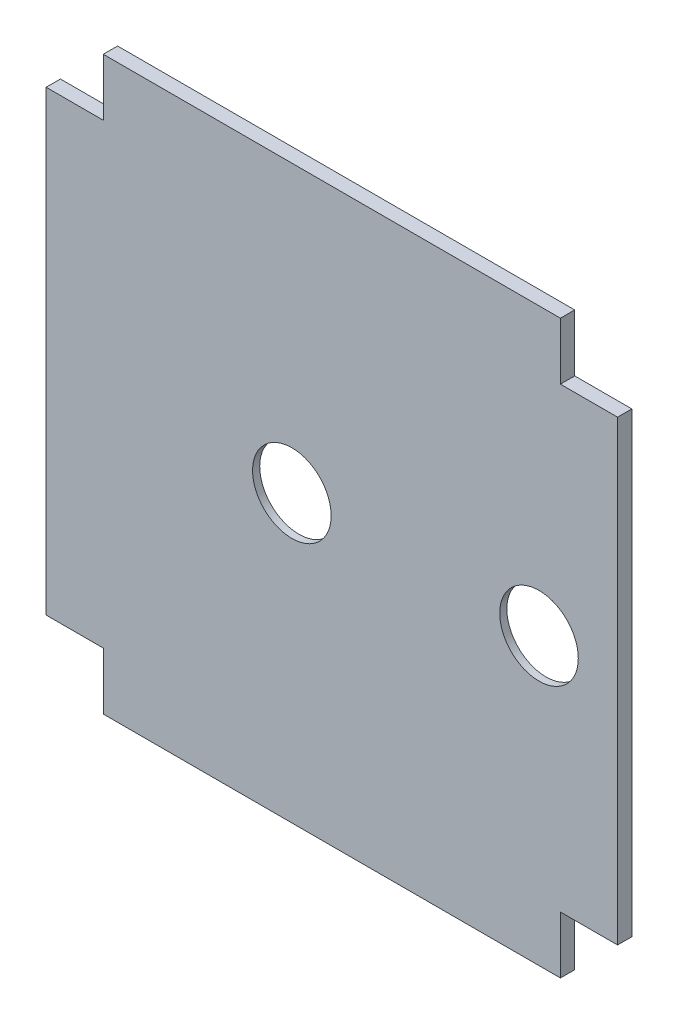
ISO-10303-21;
HEADER;
FILE_DESCRIPTION(('STEP AP214'),'2;1');
FILE_NAME('part.step','',(''),(''),'','','');
FILE_SCHEMA(('AUTOMOTIVE_DESIGN { 1 0 10303 214 1 1 1 1 }'));
ENDSEC;
DATA;
#1=APPLICATION_CONTEXT('core data for automotive mechanical design processes');
#2=APPLICATION_PROTOCOL_DEFINITION('international standard','automotive_design',2000,#1);
#3=PRODUCT_CONTEXT('',#1,'mechanical');
#4=PRODUCT('Part','Part','',(#3));
#5=PRODUCT_RELATED_PRODUCT_CATEGORY('part','',(#4));
#6=PRODUCT_DEFINITION_FORMATION('','',#4);
#7=PRODUCT_DEFINITION_CONTEXT('part definition',#1,'design');
#8=PRODUCT_DEFINITION('design','',#6,#7);
#9=PRODUCT_DEFINITION_SHAPE('','',#8);
#10=(LENGTH_UNIT() NAMED_UNIT(*) SI_UNIT(.MILLI.,.METRE.));
#11=(NAMED_UNIT(*) PLANE_ANGLE_UNIT() SI_UNIT($,.RADIAN.));
#12=(NAMED_UNIT(*) SI_UNIT($,.STERADIAN.) SOLID_ANGLE_UNIT());
#13=UNCERTAINTY_MEASURE_WITH_UNIT(LENGTH_MEASURE(1.E-05),#10,'distance_accuracy_value','');
#14=(GEOMETRIC_REPRESENTATION_CONTEXT(3) GLOBAL_UNCERTAINTY_ASSIGNED_CONTEXT((#13)) GLOBAL_UNIT_ASSIGNED_CONTEXT((#10,
#11,#12)) REPRESENTATION_CONTEXT('',''));
#15=CARTESIAN_POINT('',(0.,0.,0.));
#16=DIRECTION('',(0.,0.,1.));
#17=DIRECTION('',(1.,0.,0.));
#18=AXIS2_PLACEMENT_3D('',#15,#16,#17);
#19=CARTESIAN_POINT('',(172.000168937868,199.966321146699,0.));
#20=DIRECTION('',(0.,0.,1.));
#21=DIRECTION('',(1.,0.,0.));
#22=AXIS2_PLACEMENT_3D('',#19,#20,#21);
#23=CYLINDRICAL_SURFACE('',#22,27.5);
#24=CARTESIAN_POINT('',(172.000168937868,199.966321146699,10.));
#25=DIRECTION('',(0.,0.,1.));
#26=DIRECTION('',(1.,0.,0.));
#27=AXIS2_PLACEMENT_3D('',#24,#25,#26);
#28=CIRCLE('',#27,27.5);
#29=CARTESIAN_POINT('',(199.500168937868,199.966321146699,10.));
#30=VERTEX_POINT('',#29);
#31=EDGE_CURVE('E161',#30,#30,#28,.T.);
#32=ORIENTED_EDGE('',*,*,#31,.T.);
#33=EDGE_LOOP('',(#32));
#34=FACE_BOUND('',#33,.T.);
#35=CARTESIAN_POINT('',(172.000168937868,199.966321146699,5.));
#36=DIRECTION('',(0.,0.,-1.));
#37=DIRECTION('',(-1.,0.,0.));
#38=AXIS2_PLACEMENT_3D('',#35,#36,#37);
#39=CIRCLE('',#38,27.5);
#40=CARTESIAN_POINT('',(144.500168937868,199.966321146699,5.));
#41=VERTEX_POINT('',#40);
#42=EDGE_CURVE('E36',#41,#41,#39,.F.);
#43=ORIENTED_EDGE('',*,*,#42,.F.);
#44=EDGE_LOOP('',(#43));
#45=FACE_BOUND('',#44,.T.);
#46=ADVANCED_FACE('F32',(#34,#45),#23,.F.);
#47=CARTESIAN_POINT('',(345.000168937868,199.966321146699,0.));
#48=DIRECTION('',(0.,0.,1.));
#49=DIRECTION('',(1.,0.,0.));
#50=AXIS2_PLACEMENT_3D('',#47,#48,#49);
#51=CYLINDRICAL_SURFACE('',#50,27.5);
#52=CARTESIAN_POINT('',(345.000168937868,199.966321146699,10.));
#53=DIRECTION('',(0.,0.,1.));
#54=DIRECTION('',(1.,0.,0.));
#55=AXIS2_PLACEMENT_3D('',#52,#53,#54);
#56=CIRCLE('',#55,27.5);
#57=CARTESIAN_POINT('',(372.500168937868,199.966321146699,10.));
#58=VERTEX_POINT('',#57);
#59=EDGE_CURVE('E168',#58,#58,#56,.T.);
#60=ORIENTED_EDGE('',*,*,#59,.T.);
#61=EDGE_LOOP('',(#60));
#62=FACE_BOUND('',#61,.T.);
#63=CARTESIAN_POINT('',(345.000168937868,199.966321146699,5.));
#64=DIRECTION('',(0.,0.,-1.));
#65=DIRECTION('',(-1.,0.,0.));
#66=AXIS2_PLACEMENT_3D('',#63,#64,#65);
#67=CIRCLE('',#66,27.5);
#68=CARTESIAN_POINT('',(317.500168937868,199.966321146699,5.));
#69=VERTEX_POINT('',#68);
#70=EDGE_CURVE('E172',#69,#69,#67,.F.);
#71=ORIENTED_EDGE('',*,*,#70,.F.);
#72=EDGE_LOOP('',(#71));
#73=FACE_BOUND('',#72,.T.);
#74=ADVANCED_FACE('F218',(#62,#73),#51,.F.);
#75=CARTESIAN_POINT('',(0.,0.,10.));
#76=DIRECTION('',(-1.,0.,0.));
#77=DIRECTION('',(0.,0.,1.));
#78=AXIS2_PLACEMENT_3D('',#75,#76,#77);
#79=PLANE('',#78);
#80=DIRECTION('',(0.,0.,-1.));
#81=VECTOR('',#80,1.);
#82=CARTESIAN_POINT('',(0.,360.,10.));
#83=LINE('',#82,#81);
#84=CARTESIAN_POINT('',(0.,360.,10.));
#85=VERTEX_POINT('',#84);
#86=CARTESIAN_POINT('',(0.,360.,0.));
#87=VERTEX_POINT('',#86);
#88=EDGE_CURVE('E283',#85,#87,#83,.T.);
#89=ORIENTED_EDGE('',*,*,#88,.T.);
#90=DIRECTION('',(0.,1.,0.));
#91=VECTOR('',#90,1.);
#92=CARTESIAN_POINT('',(0.,0.,0.));
#93=LINE('',#92,#91);
#94=CARTESIAN_POINT('',(0.,40.,0.));
#95=VERTEX_POINT('',#94);
#96=EDGE_CURVE('E144',#95,#87,#93,.T.);
#97=ORIENTED_EDGE('',*,*,#96,.F.);
#98=DIRECTION('',(0.,0.,-1.));
#99=VECTOR('',#98,1.);
#100=CARTESIAN_POINT('',(0.,40.,10.));
#101=LINE('',#100,#99);
#102=CARTESIAN_POINT('',(0.,40.,10.));
#103=VERTEX_POINT('',#102);
#104=EDGE_CURVE('E128',#103,#95,#101,.T.);
#105=ORIENTED_EDGE('',*,*,#104,.F.);
#106=DIRECTION('',(0.,1.,0.));
#107=VECTOR('',#106,1.);
#108=CARTESIAN_POINT('',(0.,0.,10.));
#109=LINE('',#108,#107);
#110=EDGE_CURVE('E142',#103,#85,#109,.T.);
#111=ORIENTED_EDGE('',*,*,#110,.T.);
#112=EDGE_LOOP('',(#89,#97,#105,#111));
#113=FACE_BOUND('',#112,.T.);
#114=ADVANCED_FACE('F34',(#113),#79,.T.);
#115=CARTESIAN_POINT('',(0.,0.,10.));
#116=DIRECTION('',(0.,1.,0.));
#117=DIRECTION('',(0.,0.,1.));
#118=AXIS2_PLACEMENT_3D('',#115,#116,#117);
#119=PLANE('',#118);
#120=DIRECTION('',(1.,0.,0.));
#121=VECTOR('',#120,1.);
#122=CARTESIAN_POINT('',(0.,0.,0.));
#123=LINE('',#122,#121);
#124=CARTESIAN_POINT('',(40.,0.,0.));
#125=VERTEX_POINT('',#124);
#126=CARTESIAN_POINT('',(360.,0.,0.));
#127=VERTEX_POINT('',#126);
#128=EDGE_CURVE('E153',#125,#127,#123,.T.);
#129=ORIENTED_EDGE('',*,*,#128,.T.);
#130=DIRECTION('',(0.,0.,-1.));
#131=VECTOR('',#130,1.);
#132=CARTESIAN_POINT('',(360.,0.,10.));
#133=LINE('',#132,#131);
#134=CARTESIAN_POINT('',(360.,0.,10.));
#135=VERTEX_POINT('',#134);
#136=EDGE_CURVE('E49',#135,#127,#133,.T.);
#137=ORIENTED_EDGE('',*,*,#136,.F.);
#138=DIRECTION('',(1.,0.,0.));
#139=VECTOR('',#138,1.);
#140=CARTESIAN_POINT('',(0.,0.,10.));
#141=LINE('',#140,#139);
#142=CARTESIAN_POINT('',(40.,0.,10.));
#143=VERTEX_POINT('',#142);
#144=EDGE_CURVE('E11',#143,#135,#141,.T.);
#145=ORIENTED_EDGE('',*,*,#144,.F.);
#146=DIRECTION('',(0.,0.,-1.));
#147=VECTOR('',#146,1.);
#148=CARTESIAN_POINT('',(40.,0.,10.));
#149=LINE('',#148,#147);
#150=EDGE_CURVE('E269',#143,#125,#149,.T.);
#151=ORIENTED_EDGE('',*,*,#150,.T.);
#152=EDGE_LOOP('',(#129,#137,#145,#151));
#153=FACE_BOUND('',#152,.T.);
#154=ADVANCED_FACE('F275',(#153),#119,.F.);
#155=CARTESIAN_POINT('',(400.,0.,10.));
#156=DIRECTION('',(-1.,0.,0.));
#157=DIRECTION('',(0.,0.,1.));
#158=AXIS2_PLACEMENT_3D('',#155,#156,#157);
#159=PLANE('',#158);
#160=DIRECTION('',(0.,1.,0.));
#161=VECTOR('',#160,1.);
#162=CARTESIAN_POINT('',(400.,0.,10.));
#163=LINE('',#162,#161);
#164=CARTESIAN_POINT('',(400.,40.,10.));
#165=VERTEX_POINT('',#164);
#166=CARTESIAN_POINT('',(400.,360.,10.));
#167=VERTEX_POINT('',#166);
#168=EDGE_CURVE('E41',#165,#167,#163,.T.);
#169=ORIENTED_EDGE('',*,*,#168,.F.);
#170=DIRECTION('',(0.,0.,-1.));
#171=VECTOR('',#170,1.);
#172=CARTESIAN_POINT('',(400.,40.,10.));
#173=LINE('',#172,#171);
#174=CARTESIAN_POINT('',(400.,40.,0.));
#175=VERTEX_POINT('',#174);
#176=EDGE_CURVE('E293',#165,#175,#173,.T.);
#177=ORIENTED_EDGE('',*,*,#176,.T.);
#178=DIRECTION('',(0.,1.,0.));
#179=VECTOR('',#178,1.);
#180=CARTESIAN_POINT('',(400.,0.,0.));
#181=LINE('',#180,#179);
#182=CARTESIAN_POINT('',(400.,360.,0.));
#183=VERTEX_POINT('',#182);
#184=EDGE_CURVE('E158',#175,#183,#181,.T.);
#185=ORIENTED_EDGE('',*,*,#184,.T.);
#186=DIRECTION('',(0.,0.,-1.));
#187=VECTOR('',#186,1.);
#188=CARTESIAN_POINT('',(400.,360.,10.));
#189=LINE('',#188,#187);
#190=EDGE_CURVE('E57',#167,#183,#189,.T.);
#191=ORIENTED_EDGE('',*,*,#190,.F.);
#192=EDGE_LOOP('',(#169,#177,#185,#191));
#193=FACE_BOUND('',#192,.T.);
#194=ADVANCED_FACE('F214',(#193),#159,.F.);
#195=CARTESIAN_POINT('',(0.,400.,10.));
#196=DIRECTION('',(0.,1.,0.));
#197=DIRECTION('',(0.,0.,1.));
#198=AXIS2_PLACEMENT_3D('',#195,#196,#197);
#199=PLANE('',#198);
#200=DIRECTION('',(0.,0.,-1.));
#201=VECTOR('',#200,1.);
#202=CARTESIAN_POINT('',(40.,400.,10.));
#203=LINE('',#202,#201);
#204=CARTESIAN_POINT('',(40.,400.,10.));
#205=VERTEX_POINT('',#204);
#206=CARTESIAN_POINT('',(40.,400.,0.));
#207=VERTEX_POINT('',#206);
#208=EDGE_CURVE('E304',#205,#207,#203,.T.);
#209=ORIENTED_EDGE('',*,*,#208,.F.);
#210=DIRECTION('',(1.,0.,0.));
#211=VECTOR('',#210,1.);
#212=CARTESIAN_POINT('',(0.,400.,10.));
#213=LINE('',#212,#211);
#214=CARTESIAN_POINT('',(360.,400.,10.));
#215=VERTEX_POINT('',#214);
#216=EDGE_CURVE('E152',#205,#215,#213,.T.);
#217=ORIENTED_EDGE('',*,*,#216,.T.);
#218=DIRECTION('',(0.,0.,-1.));
#219=VECTOR('',#218,1.);
#220=CARTESIAN_POINT('',(360.,400.,10.));
#221=LINE('',#220,#219);
#222=CARTESIAN_POINT('',(360.,400.,0.));
#223=VERTEX_POINT('',#222);
#224=EDGE_CURVE('E193',#215,#223,#221,.T.);
#225=ORIENTED_EDGE('',*,*,#224,.T.);
#226=DIRECTION('',(1.,0.,0.));
#227=VECTOR('',#226,1.);
#228=CARTESIAN_POINT('',(0.,400.,0.));
#229=LINE('',#228,#227);
#230=EDGE_CURVE('E167',#207,#223,#229,.T.);
#231=ORIENTED_EDGE('',*,*,#230,.F.);
#232=EDGE_LOOP('',(#209,#217,#225,#231));
#233=FACE_BOUND('',#232,.T.);
#234=ADVANCED_FACE('F204',(#233),#199,.T.);
#235=CARTESIAN_POINT('',(0.,0.,10.));
#236=DIRECTION('',(0.,0.,-1.));
#237=DIRECTION('',(-1.,0.,0.));
#238=AXIS2_PLACEMENT_3D('',#235,#236,#237);
#239=PLANE('',#238);
#240=ORIENTED_EDGE('',*,*,#59,.F.);
#241=EDGE_LOOP('',(#240));
#242=FACE_BOUND('',#241,.T.);
#243=ORIENTED_EDGE('',*,*,#31,.F.);
#244=EDGE_LOOP('',(#243));
#245=FACE_BOUND('',#244,.T.);
#246=DIRECTION('',(0.,1.,0.));
#247=VECTOR('',#246,1.);
#248=CARTESIAN_POINT('',(360.,0.,10.));
#249=LINE('',#248,#247);
#250=CARTESIAN_POINT('',(360.,40.,10.));
#251=VERTEX_POINT('',#250);
#252=EDGE_CURVE('E285',#135,#251,#249,.T.);
#253=ORIENTED_EDGE('',*,*,#252,.T.);
#254=DIRECTION('',(1.,0.,0.));
#255=VECTOR('',#254,1.);
#256=CARTESIAN_POINT('',(400.,40.,10.));
#257=LINE('',#256,#255);
#258=EDGE_CURVE('E290',#251,#165,#257,.T.);
#259=ORIENTED_EDGE('',*,*,#258,.T.);
#260=ORIENTED_EDGE('',*,*,#168,.T.);
#261=DIRECTION('',(-1.,0.,0.));
#262=VECTOR('',#261,1.);
#263=CARTESIAN_POINT('',(400.,360.,10.));
#264=LINE('',#263,#262);
#265=CARTESIAN_POINT('',(360.,360.,10.));
#266=VERTEX_POINT('',#265);
#267=EDGE_CURVE('E310',#167,#266,#264,.T.);
#268=ORIENTED_EDGE('',*,*,#267,.T.);
#269=DIRECTION('',(0.,1.,0.));
#270=VECTOR('',#269,1.);
#271=CARTESIAN_POINT('',(360.,400.,10.));
#272=LINE('',#271,#270);
#273=EDGE_CURVE('E313',#266,#215,#272,.T.);
#274=ORIENTED_EDGE('',*,*,#273,.T.);
#275=ORIENTED_EDGE('',*,*,#216,.F.);
#276=DIRECTION('',(0.,-1.,0.));
#277=VECTOR('',#276,1.);
#278=CARTESIAN_POINT('',(40.,400.,10.));
#279=LINE('',#278,#277);
#280=CARTESIAN_POINT('',(40.,360.,10.));
#281=VERTEX_POINT('',#280);
#282=EDGE_CURVE('E300',#205,#281,#279,.T.);
#283=ORIENTED_EDGE('',*,*,#282,.T.);
#284=DIRECTION('',(-1.,0.,0.));
#285=VECTOR('',#284,1.);
#286=CARTESIAN_POINT('',(0.,360.,10.));
#287=LINE('',#286,#285);
#288=EDGE_CURVE('E151',#281,#85,#287,.T.);
#289=ORIENTED_EDGE('',*,*,#288,.T.);
#290=ORIENTED_EDGE('',*,*,#110,.F.);
#291=DIRECTION('',(1.,0.,0.));
#292=VECTOR('',#291,1.);
#293=CARTESIAN_POINT('',(0.,40.,10.));
#294=LINE('',#293,#292);
#295=CARTESIAN_POINT('',(40.,40.,10.));
#296=VERTEX_POINT('',#295);
#297=EDGE_CURVE('E124',#103,#296,#294,.T.);
#298=ORIENTED_EDGE('',*,*,#297,.T.);
#299=DIRECTION('',(0.,-1.,0.));
#300=VECTOR('',#299,1.);
#301=CARTESIAN_POINT('',(40.,0.,10.));
#302=LINE('',#301,#300);
#303=EDGE_CURVE('E135',#296,#143,#302,.T.);
#304=ORIENTED_EDGE('',*,*,#303,.T.);
#305=ORIENTED_EDGE('',*,*,#144,.T.);
#306=EDGE_LOOP('',(#253,#259,#260,#268,#274,#275,#283,#289,#290,#298,#304,#305));
#307=FACE_BOUND('',#306,.T.);
#308=ADVANCED_FACE('F148',(#242,#245,#307),#239,.F.);
#309=CARTESIAN_POINT('',(0.,0.,0.));
#310=DIRECTION('',(0.,0.,-1.));
#311=DIRECTION('',(-1.,0.,0.));
#312=AXIS2_PLACEMENT_3D('',#309,#310,#311);
#313=PLANE('',#312);
#314=DIRECTION('',(1.,0.,0.));
#315=VECTOR('',#314,1.);
#316=CARTESIAN_POINT('',(400.,40.,0.));
#317=LINE('',#316,#315);
#318=CARTESIAN_POINT('',(360.,40.,0.));
#319=VERTEX_POINT('',#318);
#320=EDGE_CURVE('E282',#319,#175,#317,.T.);
#321=ORIENTED_EDGE('',*,*,#320,.F.);
#322=DIRECTION('',(0.,1.,0.));
#323=VECTOR('',#322,1.);
#324=CARTESIAN_POINT('',(360.,0.,0.));
#325=LINE('',#324,#323);
#326=EDGE_CURVE('E280',#127,#319,#325,.T.);
#327=ORIENTED_EDGE('',*,*,#326,.F.);
#328=ORIENTED_EDGE('',*,*,#128,.F.);
#329=DIRECTION('',(0.,-1.,0.));
#330=VECTOR('',#329,1.);
#331=CARTESIAN_POINT('',(40.,0.,0.));
#332=LINE('',#331,#330);
#333=CARTESIAN_POINT('',(40.,40.,0.));
#334=VERTEX_POINT('',#333);
#335=EDGE_CURVE('E136',#334,#125,#332,.T.);
#336=ORIENTED_EDGE('',*,*,#335,.F.);
#337=DIRECTION('',(1.,0.,0.));
#338=VECTOR('',#337,1.);
#339=CARTESIAN_POINT('',(0.,40.,0.));
#340=LINE('',#339,#338);
#341=EDGE_CURVE('E271',#95,#334,#340,.T.);
#342=ORIENTED_EDGE('',*,*,#341,.F.);
#343=ORIENTED_EDGE('',*,*,#96,.T.);
#344=DIRECTION('',(-1.,0.,0.));
#345=VECTOR('',#344,1.);
#346=CARTESIAN_POINT('',(0.,360.,0.));
#347=LINE('',#346,#345);
#348=CARTESIAN_POINT('',(40.,360.,0.));
#349=VERTEX_POINT('',#348);
#350=EDGE_CURVE('E302',#349,#87,#347,.T.);
#351=ORIENTED_EDGE('',*,*,#350,.F.);
#352=DIRECTION('',(0.,-1.,0.));
#353=VECTOR('',#352,1.);
#354=CARTESIAN_POINT('',(40.,400.,0.));
#355=LINE('',#354,#353);
#356=EDGE_CURVE('E276',#207,#349,#355,.T.);
#357=ORIENTED_EDGE('',*,*,#356,.F.);
#358=ORIENTED_EDGE('',*,*,#230,.T.);
#359=DIRECTION('',(0.,1.,0.));
#360=VECTOR('',#359,1.);
#361=CARTESIAN_POINT('',(360.,400.,0.));
#362=LINE('',#361,#360);
#363=CARTESIAN_POINT('',(360.,360.,0.));
#364=VERTEX_POINT('',#363);
#365=EDGE_CURVE('E314',#364,#223,#362,.T.);
#366=ORIENTED_EDGE('',*,*,#365,.F.);
#367=DIRECTION('',(-1.,0.,0.));
#368=VECTOR('',#367,1.);
#369=CARTESIAN_POINT('',(400.,360.,0.));
#370=LINE('',#369,#368);
#371=EDGE_CURVE('E296',#183,#364,#370,.T.);
#372=ORIENTED_EDGE('',*,*,#371,.F.);
#373=ORIENTED_EDGE('',*,*,#184,.F.);
#374=EDGE_LOOP('',(#321,#327,#328,#336,#342,#343,#351,#357,#358,#366,#372,#373));
#375=FACE_BOUND('',#374,.T.);
#376=CARTESIAN_POINT('',(345.000168937868,199.966321146699,0.));
#377=DIRECTION('',(0.,0.,-1.));
#378=DIRECTION('',(-1.,0.,0.));
#379=AXIS2_PLACEMENT_3D('',#376,#377,#378);
#380=CIRCLE('',#379,35.);
#381=CARTESIAN_POINT('',(310.000168937868,199.966321146699,0.));
#382=VERTEX_POINT('',#381);
#383=EDGE_CURVE('E179',#382,#382,#380,.T.);
#384=ORIENTED_EDGE('',*,*,#383,.F.);
#385=EDGE_LOOP('',(#384));
#386=FACE_BOUND('',#385,.T.);
#387=CARTESIAN_POINT('',(172.000168937868,199.966321146699,0.));
#388=DIRECTION('',(0.,0.,-1.));
#389=DIRECTION('',(-1.,0.,0.));
#390=AXIS2_PLACEMENT_3D('',#387,#388,#389);
#391=CIRCLE('',#390,35.);
#392=CARTESIAN_POINT('',(137.000168937868,199.966321146699,0.));
#393=VERTEX_POINT('',#392);
#394=EDGE_CURVE('E191',#393,#393,#391,.T.);
#395=ORIENTED_EDGE('',*,*,#394,.F.);
#396=EDGE_LOOP('',(#395));
#397=FACE_BOUND('',#396,.T.);
#398=ADVANCED_FACE('F203',(#375,#386,#397),#313,.T.);
#399=CARTESIAN_POINT('',(345.000168937868,199.966321146699,5.));
#400=DIRECTION('',(0.,0.,-1.));
#401=DIRECTION('',(-1.,0.,0.));
#402=AXIS2_PLACEMENT_3D('',#399,#400,#401);
#403=PLANE('',#402);
#404=CARTESIAN_POINT('',(345.000168937868,199.966321146699,5.));
#405=DIRECTION('',(0.,0.,-1.));
#406=DIRECTION('',(-1.,0.,0.));
#407=AXIS2_PLACEMENT_3D('',#404,#405,#406);
#408=CIRCLE('',#407,35.);
#409=CARTESIAN_POINT('',(310.000168937868,199.966321146699,5.));
#410=VERTEX_POINT('',#409);
#411=EDGE_CURVE('E174',#410,#410,#408,.T.);
#412=ORIENTED_EDGE('',*,*,#411,.T.);
#413=EDGE_LOOP('',(#412));
#414=FACE_BOUND('',#413,.T.);
#415=ORIENTED_EDGE('',*,*,#70,.T.);
#416=EDGE_LOOP('',(#415));
#417=FACE_BOUND('',#416,.T.);
#418=ADVANCED_FACE('F211',(#414,#417),#403,.T.);
#419=CARTESIAN_POINT('',(345.000168937868,199.966321146699,5.));
#420=DIRECTION('',(0.,0.,-1.));
#421=DIRECTION('',(-1.,0.,0.));
#422=AXIS2_PLACEMENT_3D('',#419,#420,#421);
#423=CYLINDRICAL_SURFACE('',#422,35.);
#424=ORIENTED_EDGE('',*,*,#411,.F.);
#425=EDGE_LOOP('',(#424));
#426=FACE_BOUND('',#425,.T.);
#427=ORIENTED_EDGE('',*,*,#383,.T.);
#428=EDGE_LOOP('',(#427));
#429=FACE_BOUND('',#428,.T.);
#430=ADVANCED_FACE('F232',(#426,#429),#423,.F.);
#431=CARTESIAN_POINT('',(172.000168937868,199.966321146699,5.));
#432=DIRECTION('',(0.,0.,-1.));
#433=DIRECTION('',(-1.,0.,0.));
#434=AXIS2_PLACEMENT_3D('',#431,#432,#433);
#435=PLANE('',#434);
#436=CARTESIAN_POINT('',(172.000168937868,199.966321146699,5.));
#437=DIRECTION('',(0.,0.,-1.));
#438=DIRECTION('',(-1.,0.,0.));
#439=AXIS2_PLACEMENT_3D('',#436,#437,#438);
#440=CIRCLE('',#439,35.);
#441=CARTESIAN_POINT('',(137.000168937868,199.966321146699,5.));
#442=VERTEX_POINT('',#441);
#443=EDGE_CURVE('E184',#442,#442,#440,.T.);
#444=ORIENTED_EDGE('',*,*,#443,.T.);
#445=EDGE_LOOP('',(#444));
#446=FACE_BOUND('',#445,.T.);
#447=ORIENTED_EDGE('',*,*,#42,.T.);
#448=EDGE_LOOP('',(#447));
#449=FACE_BOUND('',#448,.T.);
#450=ADVANCED_FACE('F228',(#446,#449),#435,.T.);
#451=CARTESIAN_POINT('',(172.000168937868,199.966321146699,5.));
#452=DIRECTION('',(0.,0.,-1.));
#453=DIRECTION('',(-1.,0.,0.));
#454=AXIS2_PLACEMENT_3D('',#451,#452,#453);
#455=CYLINDRICAL_SURFACE('',#454,35.);
#456=ORIENTED_EDGE('',*,*,#443,.F.);
#457=EDGE_LOOP('',(#456));
#458=FACE_BOUND('',#457,.T.);
#459=ORIENTED_EDGE('',*,*,#394,.T.);
#460=EDGE_LOOP('',(#459));
#461=FACE_BOUND('',#460,.T.);
#462=ADVANCED_FACE('F224',(#458,#461),#455,.F.);
#463=CARTESIAN_POINT('',(360.,400.,10.));
#464=DIRECTION('',(-1.,0.,0.));
#465=DIRECTION('',(0.,0.,1.));
#466=AXIS2_PLACEMENT_3D('',#463,#464,#465);
#467=PLANE('',#466);
#468=ORIENTED_EDGE('',*,*,#365,.T.);
#469=ORIENTED_EDGE('',*,*,#224,.F.);
#470=ORIENTED_EDGE('',*,*,#273,.F.);
#471=DIRECTION('',(0.,0.,-1.));
#472=VECTOR('',#471,1.);
#473=CARTESIAN_POINT('',(360.,360.,10.));
#474=LINE('',#473,#472);
#475=EDGE_CURVE('E320',#266,#364,#474,.T.);
#476=ORIENTED_EDGE('',*,*,#475,.T.);
#477=EDGE_LOOP('',(#468,#469,#470,#476));
#478=FACE_BOUND('',#477,.T.);
#479=ADVANCED_FACE('F227',(#478),#467,.F.);
#480=CARTESIAN_POINT('',(400.,360.,10.));
#481=DIRECTION('',(0.,-1.,0.));
#482=DIRECTION('',(0.,0.,-1.));
#483=AXIS2_PLACEMENT_3D('',#480,#481,#482);
#484=PLANE('',#483);
#485=ORIENTED_EDGE('',*,*,#371,.T.);
#486=ORIENTED_EDGE('',*,*,#475,.F.);
#487=ORIENTED_EDGE('',*,*,#267,.F.);
#488=ORIENTED_EDGE('',*,*,#190,.T.);
#489=EDGE_LOOP('',(#485,#486,#487,#488));
#490=FACE_BOUND('',#489,.T.);
#491=ADVANCED_FACE('F239',(#490),#484,.F.);
#492=CARTESIAN_POINT('',(40.,0.,10.));
#493=DIRECTION('',(1.,0.,0.));
#494=DIRECTION('',(0.,0.,-1.));
#495=AXIS2_PLACEMENT_3D('',#492,#493,#494);
#496=PLANE('',#495);
#497=ORIENTED_EDGE('',*,*,#335,.T.);
#498=ORIENTED_EDGE('',*,*,#150,.F.);
#499=ORIENTED_EDGE('',*,*,#303,.F.);
#500=DIRECTION('',(0.,0.,-1.));
#501=VECTOR('',#500,1.);
#502=CARTESIAN_POINT('',(40.,40.,10.));
#503=LINE('',#502,#501);
#504=EDGE_CURVE('E130',#296,#334,#503,.T.);
#505=ORIENTED_EDGE('',*,*,#504,.T.);
#506=EDGE_LOOP('',(#497,#498,#499,#505));
#507=FACE_BOUND('',#506,.T.);
#508=ADVANCED_FACE('F242',(#507),#496,.F.);
#509=CARTESIAN_POINT('',(0.,40.,10.));
#510=DIRECTION('',(0.,1.,0.));
#511=DIRECTION('',(-1.,0.,0.));
#512=AXIS2_PLACEMENT_3D('',#509,#510,#511);
#513=PLANE('',#512);
#514=ORIENTED_EDGE('',*,*,#341,.T.);
#515=ORIENTED_EDGE('',*,*,#504,.F.);
#516=ORIENTED_EDGE('',*,*,#297,.F.);
#517=ORIENTED_EDGE('',*,*,#104,.T.);
#518=EDGE_LOOP('',(#514,#515,#516,#517));
#519=FACE_BOUND('',#518,.T.);
#520=ADVANCED_FACE('F127',(#519),#513,.F.);
#521=CARTESIAN_POINT('',(0.,360.,10.));
#522=DIRECTION('',(0.,-1.,0.));
#523=DIRECTION('',(0.,0.,-1.));
#524=AXIS2_PLACEMENT_3D('',#521,#522,#523);
#525=PLANE('',#524);
#526=ORIENTED_EDGE('',*,*,#350,.T.);
#527=ORIENTED_EDGE('',*,*,#88,.F.);
#528=ORIENTED_EDGE('',*,*,#288,.F.);
#529=DIRECTION('',(0.,0.,-1.));
#530=VECTOR('',#529,1.);
#531=CARTESIAN_POINT('',(40.,360.,10.));
#532=LINE('',#531,#530);
#533=EDGE_CURVE('E287',#281,#349,#532,.T.);
#534=ORIENTED_EDGE('',*,*,#533,.T.);
#535=EDGE_LOOP('',(#526,#527,#528,#534));
#536=FACE_BOUND('',#535,.T.);
#537=ADVANCED_FACE('F250',(#536),#525,.F.);
#538=CARTESIAN_POINT('',(40.,400.,10.));
#539=DIRECTION('',(1.,0.,0.));
#540=DIRECTION('',(0.,1.,0.));
#541=AXIS2_PLACEMENT_3D('',#538,#539,#540);
#542=PLANE('',#541);
#543=ORIENTED_EDGE('',*,*,#356,.T.);
#544=ORIENTED_EDGE('',*,*,#533,.F.);
#545=ORIENTED_EDGE('',*,*,#282,.F.);
#546=ORIENTED_EDGE('',*,*,#208,.T.);
#547=EDGE_LOOP('',(#543,#544,#545,#546));
#548=FACE_BOUND('',#547,.T.);
#549=ADVANCED_FACE('F246',(#548),#542,.F.);
#550=CARTESIAN_POINT('',(400.,40.,10.));
#551=DIRECTION('',(0.,1.,0.));
#552=DIRECTION('',(0.,0.,1.));
#553=AXIS2_PLACEMENT_3D('',#550,#551,#552);
#554=PLANE('',#553);
#555=ORIENTED_EDGE('',*,*,#320,.T.);
#556=ORIENTED_EDGE('',*,*,#176,.F.);
#557=ORIENTED_EDGE('',*,*,#258,.F.);
#558=DIRECTION('',(0.,0.,-1.));
#559=VECTOR('',#558,1.);
#560=CARTESIAN_POINT('',(360.,40.,10.));
#561=LINE('',#560,#559);
#562=EDGE_CURVE('E297',#251,#319,#561,.T.);
#563=ORIENTED_EDGE('',*,*,#562,.T.);
#564=EDGE_LOOP('',(#555,#556,#557,#563));
#565=FACE_BOUND('',#564,.T.);
#566=ADVANCED_FACE('F249',(#565),#554,.F.);
#567=CARTESIAN_POINT('',(360.,0.,10.));
#568=DIRECTION('',(-1.,0.,0.));
#569=DIRECTION('',(0.,0.,1.));
#570=AXIS2_PLACEMENT_3D('',#567,#568,#569);
#571=PLANE('',#570);
#572=ORIENTED_EDGE('',*,*,#326,.T.);
#573=ORIENTED_EDGE('',*,*,#562,.F.);
#574=ORIENTED_EDGE('',*,*,#252,.F.);
#575=ORIENTED_EDGE('',*,*,#136,.T.);
#576=EDGE_LOOP('',(#572,#573,#574,#575));
#577=FACE_BOUND('',#576,.T.);
#578=ADVANCED_FACE('F255',(#577),#571,.F.);
#579=CLOSED_SHELL('',(#46,#74,#114,#154,#194,#234,#308,#398,#418,#430,#450,#462,#479,#491,#508,
#520,#537,#549,#566,#578));
#580=MANIFOLD_SOLID_BREP('B2',#579);
#581=ADVANCED_BREP_SHAPE_REPRESENTATION('',(#18,#580),#14);
#582=SHAPE_DEFINITION_REPRESENTATION(#9,#581);
ENDSEC;
END-ISO-10303-21;
